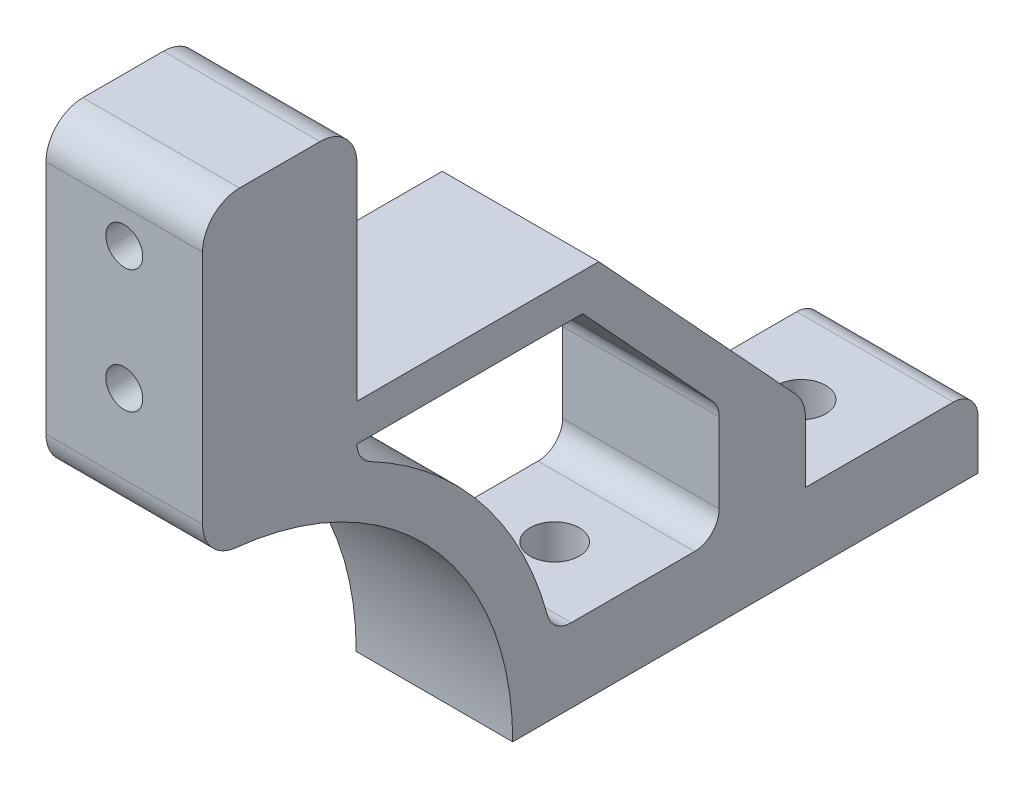
ISO-10303-21;
HEADER;
FILE_DESCRIPTION(('STEP AP214'),'2;1');
FILE_NAME('part.step','',(''),(''),'','','');
FILE_SCHEMA(('AUTOMOTIVE_DESIGN { 1 0 10303 214 1 1 1 1 }'));
ENDSEC;
DATA;
#1=APPLICATION_CONTEXT('core data for automotive mechanical design processes');
#2=APPLICATION_PROTOCOL_DEFINITION('international standard','automotive_design',2000,#1);
#3=PRODUCT_CONTEXT('',#1,'mechanical');
#4=PRODUCT('Part','Part','',(#3));
#5=PRODUCT_RELATED_PRODUCT_CATEGORY('part','',(#4));
#6=PRODUCT_DEFINITION_FORMATION('','',#4);
#7=PRODUCT_DEFINITION_CONTEXT('part definition',#1,'design');
#8=PRODUCT_DEFINITION('design','',#6,#7);
#9=PRODUCT_DEFINITION_SHAPE('','',#8);
#10=(LENGTH_UNIT() NAMED_UNIT(*) SI_UNIT(.MILLI.,.METRE.));
#11=(NAMED_UNIT(*) PLANE_ANGLE_UNIT() SI_UNIT($,.RADIAN.));
#12=(NAMED_UNIT(*) SI_UNIT($,.STERADIAN.) SOLID_ANGLE_UNIT());
#13=UNCERTAINTY_MEASURE_WITH_UNIT(LENGTH_MEASURE(1.E-05),#10,'distance_accuracy_value','');
#14=(GEOMETRIC_REPRESENTATION_CONTEXT(3) GLOBAL_UNCERTAINTY_ASSIGNED_CONTEXT((#13)) GLOBAL_UNIT_ASSIGNED_CONTEXT((#10,
#11,#12)) REPRESENTATION_CONTEXT('',''));
#15=CARTESIAN_POINT('',(0.,0.,0.));
#16=DIRECTION('',(0.,0.,1.));
#17=DIRECTION('',(1.,0.,0.));
#18=AXIS2_PLACEMENT_3D('',#15,#16,#17);
#19=CARTESIAN_POINT('',(12.7,8.92166748068362,-46.9999999999973));
#20=DIRECTION('',(-1.,0.,0.));
#21=DIRECTION('',(0.,0.,1.));
#22=AXIS2_PLACEMENT_3D('',#19,#20,#21);
#23=PLANE('',#22);
#24=DIRECTION('',(0.,0.,1.));
#25=VECTOR('',#24,1.);
#26=CARTESIAN_POINT('',(12.7,28.2515815883742,-13.6143991895037));
#27=LINE('',#26,#25);
#28=CARTESIAN_POINT('',(12.7,28.2515815883742,-33.2348630597838));
#29=VERTEX_POINT('',#28);
#30=CARTESIAN_POINT('',(12.7,28.2515815883742,-13.6143991895037));
#31=VERTEX_POINT('',#30);
#32=EDGE_CURVE('E308',#29,#31,#27,.T.);
#33=ORIENTED_EDGE('',*,*,#32,.T.);
#34=DIRECTION('',(0.,1.,0.));
#35=VECTOR('',#34,1.);
#36=CARTESIAN_POINT('',(12.7,39.9642299118946,-13.6143991895038));
#37=LINE('',#36,#35);
#38=CARTESIAN_POINT('',(12.7,45.0000000000114,-13.6143991895038));
#39=VERTEX_POINT('',#38);
#40=EDGE_CURVE('E312',#31,#39,#37,.T.);
#41=ORIENTED_EDGE('',*,*,#40,.T.);
#42=CARTESIAN_POINT('',(12.7,45.0000000000114,-10.6143991895038));
#43=DIRECTION('',(1.,0.,0.));
#44=DIRECTION('',(0.,0.,-1.));
#45=AXIS2_PLACEMENT_3D('',#42,#43,#44);
#46=CIRCLE('',#45,3.);
#47=CARTESIAN_POINT('',(12.7,48.0000000000114,-10.6143991895037));
#48=VERTEX_POINT('',#47);
#49=EDGE_CURVE('E316',#39,#48,#46,.T.);
#50=ORIENTED_EDGE('',*,*,#49,.T.);
#51=DIRECTION('',(0.,0.,1.));
#52=VECTOR('',#51,1.);
#53=CARTESIAN_POINT('',(12.7,48.0000000000114,-4.0846846062337));
#54=LINE('',#53,#52);
#55=CARTESIAN_POINT('',(12.7,48.0000000000114,-4.0846846062337));
#56=VERTEX_POINT('',#55);
#57=EDGE_CURVE('E319',#48,#56,#54,.T.);
#58=ORIENTED_EDGE('',*,*,#57,.T.);
#59=CARTESIAN_POINT('',(12.7,45.0000000000114,-4.08468460623368));
#60=DIRECTION('',(1.,0.,0.));
#61=DIRECTION('',(0.,0.,1.));
#62=AXIS2_PLACEMENT_3D('',#59,#60,#61);
#63=CIRCLE('',#62,3.);
#64=CARTESIAN_POINT('',(12.7,45.0000000000114,-1.08468460623368));
#65=VERTEX_POINT('',#64);
#66=EDGE_CURVE('E322',#56,#65,#63,.T.);
#67=ORIENTED_EDGE('',*,*,#66,.T.);
#68=DIRECTION('',(0.,-1.,0.));
#69=VECTOR('',#68,1.);
#70=CARTESIAN_POINT('',(12.7,25.8574133060414,-1.08468460623368));
#71=LINE('',#70,#69);
#72=CARTESIAN_POINT('',(12.7,25.8574133060414,-1.08468460623368));
#73=VERTEX_POINT('',#72);
#74=EDGE_CURVE('E325',#65,#73,#71,.T.);
#75=ORIENTED_EDGE('',*,*,#74,.T.);
#76=CARTESIAN_POINT('',(12.7,25.8574133060414,-4.08468460623368));
#77=DIRECTION('',(1.,0.,0.));
#78=DIRECTION('',(0.,0.,1.));
#79=AXIS2_PLACEMENT_3D('',#76,#77,#78);
#80=CIRCLE('',#79,3.);
#81=CARTESIAN_POINT('',(12.7,22.8727826576573,-3.78140273614149));
#82=VERTEX_POINT('',#81);
#83=EDGE_CURVE('E328',#73,#82,#80,.T.);
#84=ORIENTED_EDGE('',*,*,#83,.T.);
#85=CARTESIAN_POINT('',(12.7,-1.99913941220975,-1.25405381870654));
#86=DIRECTION('',(-1.,0.,0.));
#87=DIRECTION('',(0.,0.,1.));
#88=AXIS2_PLACEMENT_3D('',#85,#86,#87);
#89=CIRCLE('',#88,25.);
#90=CARTESIAN_POINT('',(12.7,-1.99913941220964,-26.2540538187065));
#91=VERTEX_POINT('',#90);
#92=EDGE_CURVE('E331',#82,#91,#89,.T.);
#93=ORIENTED_EDGE('',*,*,#92,.T.);
#94=DIRECTION('',(0.,0.,-1.));
#95=VECTOR('',#94,1.);
#96=CARTESIAN_POINT('',(12.7,-1.99913941220964,-26.2540538187065));
#97=LINE('',#96,#95);
#98=CARTESIAN_POINT('',(12.7,-1.99913941220963,-63.9999999999972));
#99=VERTEX_POINT('',#98);
#100=EDGE_CURVE('E334',#91,#99,#97,.T.);
#101=ORIENTED_EDGE('',*,*,#100,.T.);
#102=DIRECTION('',(0.,1.,0.));
#103=VECTOR('',#102,1.);
#104=CARTESIAN_POINT('',(12.7,2.00086058779035,-63.9999999999973));
#105=LINE('',#104,#103);
#106=CARTESIAN_POINT('',(12.7,2.00086058779035,-63.9999999999973));
#107=VERTEX_POINT('',#106);
#108=EDGE_CURVE('E337',#99,#107,#105,.T.);
#109=ORIENTED_EDGE('',*,*,#108,.T.);
#110=CARTESIAN_POINT('',(12.7,2.00086058779037,-61.9999999999973));
#111=DIRECTION('',(1.,0.,0.));
#112=DIRECTION('',(0.,0.,1.));
#113=AXIS2_PLACEMENT_3D('',#110,#111,#112);
#114=CIRCLE('',#113,2.);
#115=CARTESIAN_POINT('',(12.7,4.00086058779037,-61.9999999999972));
#116=VERTEX_POINT('',#115);
#117=EDGE_CURVE('E340',#107,#116,#114,.T.);
#118=ORIENTED_EDGE('',*,*,#117,.T.);
#119=DIRECTION('',(0.,0.,1.));
#120=VECTOR('',#119,1.);
#121=CARTESIAN_POINT('',(12.7,4.00086058779036,-49.9999999999973));
#122=LINE('',#121,#120);
#123=CARTESIAN_POINT('',(12.7,4.00086058779036,-49.9999999999973));
#124=VERTEX_POINT('',#123);
#125=EDGE_CURVE('E343',#116,#124,#122,.T.);
#126=ORIENTED_EDGE('',*,*,#125,.T.);
#127=DIRECTION('',(0.,1.,0.));
#128=VECTOR('',#127,1.);
#129=CARTESIAN_POINT('',(12.7,4.00086058779036,-49.9999999999973));
#130=LINE('',#129,#128);
#131=CARTESIAN_POINT('',(12.7,8.92166748068362,-49.9999999999973));
#132=VERTEX_POINT('',#131);
#133=EDGE_CURVE('E346',#124,#132,#130,.T.);
#134=ORIENTED_EDGE('',*,*,#133,.T.);
#135=CARTESIAN_POINT('',(12.7,8.92166748068362,-46.9999999999973));
#136=DIRECTION('',(1.,0.,0.));
#137=DIRECTION('',(0.,0.,1.));
#138=AXIS2_PLACEMENT_3D('',#135,#136,#137);
#139=CIRCLE('',#138,3.);
#140=CARTESIAN_POINT('',(12.7,10.9568424444333,-49.2041013740104));
#141=VERTEX_POINT('',#140);
#142=EDGE_CURVE('E349',#132,#141,#139,.T.);
#143=ORIENTED_EDGE('',*,*,#142,.T.);
#144=DIRECTION('',(0.,0.734700458004376,0.67839165458322));
#145=VECTOR('',#144,1.);
#146=CARTESIAN_POINT('',(12.7,10.9568424444333,-49.2041013740104));
#147=LINE('',#146,#145);
#148=EDGE_CURVE('E352',#141,#29,#147,.T.);
#149=ORIENTED_EDGE('',*,*,#148,.T.);
#150=EDGE_LOOP('',(#33,#41,#50,#58,#67,#75,#84,#93,#101,#109,#118,#126,#134,#143,#149));
#151=FACE_BOUND('',#150,.T.);
#152=CARTESIAN_POINT('',(12.7,12.4715383137878,-40.9999999999973));
#153=DIRECTION('',(1.,0.,0.));
#154=DIRECTION('',(0.,0.,1.));
#155=AXIS2_PLACEMENT_3D('',#152,#153,#154);
#156=CIRCLE('',#155,2.);
#157=CARTESIAN_POINT('',(12.7,12.4715383137878,-42.9999999999973));
#158=VERTEX_POINT('',#157);
#159=CARTESIAN_POINT('',(12.7,13.8283216229542,-42.469400916006));
#160=VERTEX_POINT('',#159);
#161=EDGE_CURVE('E207',#158,#160,#156,.T.);
#162=ORIENTED_EDGE('',*,*,#161,.F.);
#163=DIRECTION('',(0.,1.,0.));
#164=VECTOR('',#163,1.);
#165=CARTESIAN_POINT('',(12.7,12.4715383137878,-42.9999999999973));
#166=LINE('',#165,#164);
#167=CARTESIAN_POINT('',(12.7,6.00086058779037,-42.9999999999973));
#168=VERTEX_POINT('',#167);
#169=EDGE_CURVE('E252',#168,#158,#166,.T.);
#170=ORIENTED_EDGE('',*,*,#169,.F.);
#171=CARTESIAN_POINT('',(12.7,6.00086058779037,-40.9999999999973));
#172=DIRECTION('',(1.,0.,0.));
#173=DIRECTION('',(0.,0.,1.));
#174=AXIS2_PLACEMENT_3D('',#171,#172,#173);
#175=CIRCLE('',#174,2.);
#176=CARTESIAN_POINT('',(12.7,4.00086058779036,-40.9999999999973));
#177=VERTEX_POINT('',#176);
#178=EDGE_CURVE('E249',#177,#168,#175,.T.);
#179=ORIENTED_EDGE('',*,*,#178,.F.);
#180=DIRECTION('',(0.,0.,-1.));
#181=VECTOR('',#180,1.);
#182=CARTESIAN_POINT('',(12.7,4.00086058779036,-40.9999999999973));
#183=LINE('',#182,#181);
#184=CARTESIAN_POINT('',(12.7,4.00086058779037,-30.9999999999973));
#185=VERTEX_POINT('',#184);
#186=EDGE_CURVE('E246',#185,#177,#183,.T.);
#187=ORIENTED_EDGE('',*,*,#186,.F.);
#188=CARTESIAN_POINT('',(12.7,6.00086058779036,-30.9999999999973));
#189=DIRECTION('',(1.,0.,0.));
#190=DIRECTION('',(0.,0.,1.));
#191=AXIS2_PLACEMENT_3D('',#188,#189,#190);
#192=CIRCLE('',#191,2.);
#193=CARTESIAN_POINT('',(12.7,5.4814297055303,-29.0686296164212));
#194=VERTEX_POINT('',#193);
#195=EDGE_CURVE('E243',#194,#185,#192,.T.);
#196=ORIENTED_EDGE('',*,*,#195,.F.);
#197=CARTESIAN_POINT('',(12.7,-1.99913941220975,-1.25405381870654));
#198=DIRECTION('',(-1.,0.,0.));
#199=DIRECTION('',(0.,0.,-1.));
#200=AXIS2_PLACEMENT_3D('',#197,#198,#199);
#201=CIRCLE('',#200,28.8029432720356);
#202=CARTESIAN_POINT('',(12.7,23.4822233319297,-14.6819983313147));
#203=VERTEX_POINT('',#202);
#204=EDGE_CURVE('E240',#203,#194,#201,.T.);
#205=ORIENTED_EDGE('',*,*,#204,.F.);
#206=CARTESIAN_POINT('',(12.7,25.2515815883742,-15.6143991895038));
#207=DIRECTION('',(1.,0.,0.));
#208=DIRECTION('',(0.,0.,-1.));
#209=AXIS2_PLACEMENT_3D('',#206,#207,#208);
#210=CIRCLE('',#209,2.);
#211=CARTESIAN_POINT('',(12.7,25.2515815883742,-13.6143991895038));
#212=VERTEX_POINT('',#211);
#213=EDGE_CURVE('E234',#212,#203,#210,.T.);
#214=ORIENTED_EDGE('',*,*,#213,.F.);
#215=DIRECTION('',(0.,0.,1.));
#216=VECTOR('',#215,1.);
#217=CARTESIAN_POINT('',(12.7,25.2515815883742,-13.6143991895038));
#218=LINE('',#217,#216);
#219=CARTESIAN_POINT('',(12.7,25.2515815883742,-31.9216407448406));
#220=VERTEX_POINT('',#219);
#221=EDGE_CURVE('E230',#220,#212,#218,.T.);
#222=ORIENTED_EDGE('',*,*,#221,.F.);
#223=DIRECTION('',(0.,0.734700458004377,0.67839165458322));
#224=VECTOR('',#223,1.);
#225=CARTESIAN_POINT('',(12.7,13.8283216229542,-42.469400916006));
#226=LINE('',#225,#224);
#227=EDGE_CURVE('E216',#160,#220,#226,.T.);
#228=ORIENTED_EDGE('',*,*,#227,.F.);
#229=EDGE_LOOP('',(#162,#170,#179,#187,#196,#205,#214,#222,#228));
#230=FACE_BOUND('',#229,.T.);
#231=ADVANCED_FACE('F43',(#151,#230),#23,.F.);
#232=CARTESIAN_POINT('',(0.,8.92166748068362,-46.9999999999973));
#233=DIRECTION('',(-1.,0.,0.));
#234=DIRECTION('',(0.,0.,1.));
#235=AXIS2_PLACEMENT_3D('',#232,#233,#234);
#236=PLANE('',#235);
#237=DIRECTION('',(0.,0.,1.));
#238=VECTOR('',#237,1.);
#239=CARTESIAN_POINT('',(0.,28.2515815883742,-13.6143991895037));
#240=LINE('',#239,#238);
#241=CARTESIAN_POINT('',(0.,28.2515815883742,-33.2348630597838));
#242=VERTEX_POINT('',#241);
#243=CARTESIAN_POINT('',(0.,28.2515815883742,-13.6143991895037));
#244=VERTEX_POINT('',#243);
#245=EDGE_CURVE('E225',#242,#244,#240,.T.);
#246=ORIENTED_EDGE('',*,*,#245,.F.);
#247=DIRECTION('',(0.,0.734700458004376,0.67839165458322));
#248=VECTOR('',#247,1.);
#249=CARTESIAN_POINT('',(0.,10.9568424444333,-49.2041013740104));
#250=LINE('',#249,#248);
#251=CARTESIAN_POINT('',(0.,10.9568424444333,-49.2041013740104));
#252=VERTEX_POINT('',#251);
#253=EDGE_CURVE('E313',#252,#242,#250,.T.);
#254=ORIENTED_EDGE('',*,*,#253,.F.);
#255=CARTESIAN_POINT('',(0.,8.92166748068362,-46.9999999999973));
#256=DIRECTION('',(1.,0.,0.));
#257=DIRECTION('',(0.,0.,1.));
#258=AXIS2_PLACEMENT_3D('',#255,#256,#257);
#259=CIRCLE('',#258,3.);
#260=CARTESIAN_POINT('',(0.,8.92166748068362,-49.9999999999973));
#261=VERTEX_POINT('',#260);
#262=EDGE_CURVE('E395',#261,#252,#259,.T.);
#263=ORIENTED_EDGE('',*,*,#262,.F.);
#264=DIRECTION('',(0.,1.,0.));
#265=VECTOR('',#264,1.);
#266=CARTESIAN_POINT('',(0.,4.00086058779036,-49.9999999999973));
#267=LINE('',#266,#265);
#268=CARTESIAN_POINT('',(0.,4.00086058779036,-49.9999999999973));
#269=VERTEX_POINT('',#268);
#270=EDGE_CURVE('E392',#269,#261,#267,.T.);
#271=ORIENTED_EDGE('',*,*,#270,.F.);
#272=DIRECTION('',(0.,0.,1.));
#273=VECTOR('',#272,1.);
#274=CARTESIAN_POINT('',(0.,4.00086058779036,-49.9999999999973));
#275=LINE('',#274,#273);
#276=CARTESIAN_POINT('',(0.,4.00086058779037,-61.9999999999972));
#277=VERTEX_POINT('',#276);
#278=EDGE_CURVE('E389',#277,#269,#275,.T.);
#279=ORIENTED_EDGE('',*,*,#278,.F.);
#280=CARTESIAN_POINT('',(0.,2.00086058779037,-61.9999999999973));
#281=DIRECTION('',(1.,0.,0.));
#282=DIRECTION('',(0.,0.,1.));
#283=AXIS2_PLACEMENT_3D('',#280,#281,#282);
#284=CIRCLE('',#283,2.);
#285=CARTESIAN_POINT('',(0.,2.00086058779035,-63.9999999999973));
#286=VERTEX_POINT('',#285);
#287=EDGE_CURVE('E386',#286,#277,#284,.T.);
#288=ORIENTED_EDGE('',*,*,#287,.F.);
#289=DIRECTION('',(0.,1.,0.));
#290=VECTOR('',#289,1.);
#291=CARTESIAN_POINT('',(0.,2.00086058779035,-63.9999999999973));
#292=LINE('',#291,#290);
#293=CARTESIAN_POINT('',(0.,-1.99913941220963,-63.9999999999972));
#294=VERTEX_POINT('',#293);
#295=EDGE_CURVE('E383',#294,#286,#292,.T.);
#296=ORIENTED_EDGE('',*,*,#295,.F.);
#297=DIRECTION('',(0.,0.,-1.));
#298=VECTOR('',#297,1.);
#299=CARTESIAN_POINT('',(0.,-1.99913941220964,-26.2540538187065));
#300=LINE('',#299,#298);
#301=CARTESIAN_POINT('',(0.,-1.99913941220964,-26.2540538187065));
#302=VERTEX_POINT('',#301);
#303=EDGE_CURVE('E380',#302,#294,#300,.T.);
#304=ORIENTED_EDGE('',*,*,#303,.F.);
#305=CARTESIAN_POINT('',(0.,-1.99913941220975,-1.25405381870654));
#306=DIRECTION('',(-1.,0.,0.));
#307=DIRECTION('',(0.,0.,1.));
#308=AXIS2_PLACEMENT_3D('',#305,#306,#307);
#309=CIRCLE('',#308,25.);
#310=CARTESIAN_POINT('',(0.,22.8727826576573,-3.78140273614149));
#311=VERTEX_POINT('',#310);
#312=EDGE_CURVE('E377',#311,#302,#309,.T.);
#313=ORIENTED_EDGE('',*,*,#312,.F.);
#314=CARTESIAN_POINT('',(0.,25.8574133060414,-4.08468460623368));
#315=DIRECTION('',(1.,0.,0.));
#316=DIRECTION('',(0.,0.,1.));
#317=AXIS2_PLACEMENT_3D('',#314,#315,#316);
#318=CIRCLE('',#317,3.);
#319=CARTESIAN_POINT('',(0.,25.8574133060414,-1.08468460623368));
#320=VERTEX_POINT('',#319);
#321=EDGE_CURVE('E374',#320,#311,#318,.T.);
#322=ORIENTED_EDGE('',*,*,#321,.F.);
#323=DIRECTION('',(0.,-1.,0.));
#324=VECTOR('',#323,1.);
#325=CARTESIAN_POINT('',(0.,25.8574133060414,-1.08468460623368));
#326=LINE('',#325,#324);
#327=CARTESIAN_POINT('',(0.,45.0000000000114,-1.08468460623368));
#328=VERTEX_POINT('',#327);
#329=EDGE_CURVE('E371',#328,#320,#326,.T.);
#330=ORIENTED_EDGE('',*,*,#329,.F.);
#331=CARTESIAN_POINT('',(0.,45.0000000000114,-4.08468460623368));
#332=DIRECTION('',(1.,0.,0.));
#333=DIRECTION('',(0.,0.,1.));
#334=AXIS2_PLACEMENT_3D('',#331,#332,#333);
#335=CIRCLE('',#334,3.);
#336=CARTESIAN_POINT('',(0.,48.0000000000114,-4.0846846062337));
#337=VERTEX_POINT('',#336);
#338=EDGE_CURVE('E368',#337,#328,#335,.T.);
#339=ORIENTED_EDGE('',*,*,#338,.F.);
#340=DIRECTION('',(0.,0.,1.));
#341=VECTOR('',#340,1.);
#342=CARTESIAN_POINT('',(0.,48.0000000000114,-4.0846846062337));
#343=LINE('',#342,#341);
#344=CARTESIAN_POINT('',(0.,48.0000000000114,-10.6143991895037));
#345=VERTEX_POINT('',#344);
#346=EDGE_CURVE('E365',#345,#337,#343,.T.);
#347=ORIENTED_EDGE('',*,*,#346,.F.);
#348=CARTESIAN_POINT('',(0.,45.0000000000114,-10.6143991895038));
#349=DIRECTION('',(1.,0.,0.));
#350=DIRECTION('',(0.,0.,-1.));
#351=AXIS2_PLACEMENT_3D('',#348,#349,#350);
#352=CIRCLE('',#351,3.);
#353=CARTESIAN_POINT('',(0.,45.0000000000114,-13.6143991895038));
#354=VERTEX_POINT('',#353);
#355=EDGE_CURVE('E362',#354,#345,#352,.T.);
#356=ORIENTED_EDGE('',*,*,#355,.F.);
#357=DIRECTION('',(0.,1.,0.));
#358=VECTOR('',#357,1.);
#359=CARTESIAN_POINT('',(0.,39.9642299118946,-13.6143991895038));
#360=LINE('',#359,#358);
#361=EDGE_CURVE('E359',#244,#354,#360,.T.);
#362=ORIENTED_EDGE('',*,*,#361,.F.);
#363=EDGE_LOOP('',(#246,#254,#263,#271,#279,#288,#296,#304,#313,#322,#330,#339,#347,#356,#362));
#364=FACE_BOUND('',#363,.T.);
#365=DIRECTION('',(0.,1.,0.));
#366=VECTOR('',#365,1.);
#367=CARTESIAN_POINT('',(0.,12.4715383137878,-42.9999999999973));
#368=LINE('',#367,#366);
#369=CARTESIAN_POINT('',(0.,6.00086058779037,-42.9999999999973));
#370=VERTEX_POINT('',#369);
#371=CARTESIAN_POINT('',(0.,12.4715383137878,-42.9999999999973));
#372=VERTEX_POINT('',#371);
#373=EDGE_CURVE('E217',#370,#372,#368,.T.);
#374=ORIENTED_EDGE('',*,*,#373,.T.);
#375=CARTESIAN_POINT('',(0.,12.4715383137878,-40.9999999999973));
#376=DIRECTION('',(1.,0.,0.));
#377=DIRECTION('',(0.,0.,1.));
#378=AXIS2_PLACEMENT_3D('',#375,#376,#377);
#379=CIRCLE('',#378,2.);
#380=CARTESIAN_POINT('',(0.,13.8283216229542,-42.469400916006));
#381=VERTEX_POINT('',#380);
#382=EDGE_CURVE('E69',#372,#381,#379,.T.);
#383=ORIENTED_EDGE('',*,*,#382,.T.);
#384=DIRECTION('',(0.,0.734700458004377,0.67839165458322));
#385=VECTOR('',#384,1.);
#386=CARTESIAN_POINT('',(0.,13.8283216229542,-42.469400916006));
#387=LINE('',#386,#385);
#388=CARTESIAN_POINT('',(0.,25.2515815883742,-31.9216407448406));
#389=VERTEX_POINT('',#388);
#390=EDGE_CURVE('E223',#381,#389,#387,.T.);
#391=ORIENTED_EDGE('',*,*,#390,.T.);
#392=DIRECTION('',(0.,0.,1.));
#393=VECTOR('',#392,1.);
#394=CARTESIAN_POINT('',(0.,25.2515815883742,-13.6143991895038));
#395=LINE('',#394,#393);
#396=CARTESIAN_POINT('',(0.,25.2515815883742,-13.6143991895038));
#397=VERTEX_POINT('',#396);
#398=EDGE_CURVE('E260',#389,#397,#395,.T.);
#399=ORIENTED_EDGE('',*,*,#398,.T.);
#400=CARTESIAN_POINT('',(0.,25.2515815883742,-15.6143991895038));
#401=DIRECTION('',(1.,0.,0.));
#402=DIRECTION('',(0.,0.,-1.));
#403=AXIS2_PLACEMENT_3D('',#400,#401,#402);
#404=CIRCLE('',#403,2.);
#405=CARTESIAN_POINT('',(0.,23.4822233319297,-14.6819983313147));
#406=VERTEX_POINT('',#405);
#407=EDGE_CURVE('E264',#397,#406,#404,.T.);
#408=ORIENTED_EDGE('',*,*,#407,.T.);
#409=CARTESIAN_POINT('',(0.,-1.99913941220975,-1.25405381870654));
#410=DIRECTION('',(-1.,0.,0.));
#411=DIRECTION('',(0.,0.,-1.));
#412=AXIS2_PLACEMENT_3D('',#409,#410,#411);
#413=CIRCLE('',#412,28.8029432720356);
#414=CARTESIAN_POINT('',(0.,5.4814297055303,-29.0686296164212));
#415=VERTEX_POINT('',#414);
#416=EDGE_CURVE('E268',#406,#415,#413,.T.);
#417=ORIENTED_EDGE('',*,*,#416,.T.);
#418=CARTESIAN_POINT('',(0.,6.00086058779036,-30.9999999999973));
#419=DIRECTION('',(1.,0.,0.));
#420=DIRECTION('',(0.,0.,1.));
#421=AXIS2_PLACEMENT_3D('',#418,#419,#420);
#422=CIRCLE('',#421,2.);
#423=CARTESIAN_POINT('',(0.,4.00086058779037,-30.9999999999973));
#424=VERTEX_POINT('',#423);
#425=EDGE_CURVE('E272',#415,#424,#422,.T.);
#426=ORIENTED_EDGE('',*,*,#425,.T.);
#427=DIRECTION('',(0.,0.,-1.));
#428=VECTOR('',#427,1.);
#429=CARTESIAN_POINT('',(0.,4.00086058779036,-40.9999999999973));
#430=LINE('',#429,#428);
#431=CARTESIAN_POINT('',(0.,4.00086058779036,-40.9999999999973));
#432=VERTEX_POINT('',#431);
#433=EDGE_CURVE('E276',#424,#432,#430,.T.);
#434=ORIENTED_EDGE('',*,*,#433,.T.);
#435=CARTESIAN_POINT('',(0.,6.00086058779037,-40.9999999999973));
#436=DIRECTION('',(1.,0.,0.));
#437=DIRECTION('',(0.,0.,1.));
#438=AXIS2_PLACEMENT_3D('',#435,#436,#437);
#439=CIRCLE('',#438,2.);
#440=EDGE_CURVE('E280',#432,#370,#439,.T.);
#441=ORIENTED_EDGE('',*,*,#440,.T.);
#442=EDGE_LOOP('',(#374,#383,#391,#399,#408,#417,#426,#434,#441));
#443=FACE_BOUND('',#442,.T.);
#444=ADVANCED_FACE('F506',(#364,#443),#236,.T.);
#445=CARTESIAN_POINT('',(12.7,28.2515815883742,-13.6143991895037));
#446=DIRECTION('',(0.,-1.,0.));
#447=DIRECTION('',(0.,0.,-1.));
#448=AXIS2_PLACEMENT_3D('',#445,#446,#447);
#449=PLANE('',#448);
#450=ORIENTED_EDGE('',*,*,#245,.T.);
#451=DIRECTION('',(-1.,0.,0.));
#452=VECTOR('',#451,1.);
#453=CARTESIAN_POINT('',(12.7,28.2515815883742,-13.6143991895037));
#454=LINE('',#453,#452);
#455=EDGE_CURVE('E11',#31,#244,#454,.T.);
#456=ORIENTED_EDGE('',*,*,#455,.F.);
#457=ORIENTED_EDGE('',*,*,#32,.F.);
#458=DIRECTION('',(-1.,0.,0.));
#459=VECTOR('',#458,1.);
#460=CARTESIAN_POINT('',(12.7,28.2515815883742,-33.2348630597838));
#461=LINE('',#460,#459);
#462=EDGE_CURVE('E355',#29,#242,#461,.T.);
#463=ORIENTED_EDGE('',*,*,#462,.T.);
#464=EDGE_LOOP('',(#450,#456,#457,#463));
#465=FACE_BOUND('',#464,.T.);
#466=ADVANCED_FACE('F45',(#465),#449,.F.);
#467=CARTESIAN_POINT('',(12.7,39.9642299118946,-13.6143991895038));
#468=DIRECTION('',(0.,0.,1.));
#469=DIRECTION('',(1.,0.,0.));
#470=AXIS2_PLACEMENT_3D('',#467,#468,#469);
#471=PLANE('',#470);
#472=CARTESIAN_POINT('',(6.35,32.2515815883742,-13.6143991895037));
#473=DIRECTION('',(0.,0.,-1.));
#474=DIRECTION('',(0.,1.,0.));
#475=AXIS2_PLACEMENT_3D('',#472,#473,#474);
#476=CIRCLE('',#475,1.5);
#477=CARTESIAN_POINT('',(6.35,33.7515815883742,-13.6143991895037));
#478=VERTEX_POINT('',#477);
#479=EDGE_CURVE('E456',#478,#478,#476,.T.);
#480=ORIENTED_EDGE('',*,*,#479,.F.);
#481=EDGE_LOOP('',(#480));
#482=FACE_BOUND('',#481,.T.);
#483=CARTESIAN_POINT('',(6.35,42.2515815883742,-13.6143991895037));
#484=DIRECTION('',(0.,0.,-1.));
#485=DIRECTION('',(0.,1.,0.));
#486=AXIS2_PLACEMENT_3D('',#483,#484,#485);
#487=CIRCLE('',#486,1.5);
#488=CARTESIAN_POINT('',(6.35,43.7515815883742,-13.6143991895037));
#489=VERTEX_POINT('',#488);
#490=EDGE_CURVE('E464',#489,#489,#487,.T.);
#491=ORIENTED_EDGE('',*,*,#490,.F.);
#492=EDGE_LOOP('',(#491));
#493=FACE_BOUND('',#492,.T.);
#494=ORIENTED_EDGE('',*,*,#361,.T.);
#495=DIRECTION('',(-1.,0.,0.));
#496=VECTOR('',#495,1.);
#497=CARTESIAN_POINT('',(12.7,45.0000000000114,-13.6143991895038));
#498=LINE('',#497,#496);
#499=EDGE_CURVE('E53',#39,#354,#498,.T.);
#500=ORIENTED_EDGE('',*,*,#499,.F.);
#501=ORIENTED_EDGE('',*,*,#40,.F.);
#502=ORIENTED_EDGE('',*,*,#455,.T.);
#503=EDGE_LOOP('',(#494,#500,#501,#502));
#504=FACE_BOUND('',#503,.T.);
#505=ADVANCED_FACE('F565',(#482,#493,#504),#471,.F.);
#506=CARTESIAN_POINT('',(12.7,45.0000000000114,-10.6143991895038));
#507=DIRECTION('',(-1.,0.,0.));
#508=DIRECTION('',(0.,0.,1.));
#509=AXIS2_PLACEMENT_3D('',#506,#507,#508);
#510=CYLINDRICAL_SURFACE('',#509,3.);
#511=ORIENTED_EDGE('',*,*,#355,.T.);
#512=DIRECTION('',(-1.,0.,0.));
#513=VECTOR('',#512,1.);
#514=CARTESIAN_POINT('',(12.7,48.0000000000114,-10.6143991895037));
#515=LINE('',#514,#513);
#516=EDGE_CURVE('E447',#48,#345,#515,.T.);
#517=ORIENTED_EDGE('',*,*,#516,.F.);
#518=ORIENTED_EDGE('',*,*,#49,.F.);
#519=ORIENTED_EDGE('',*,*,#499,.T.);
#520=EDGE_LOOP('',(#511,#517,#518,#519));
#521=FACE_BOUND('',#520,.T.);
#522=ADVANCED_FACE('F562',(#521),#510,.T.);
#523=CARTESIAN_POINT('',(12.7,48.0000000000114,-4.0846846062337));
#524=DIRECTION('',(0.,-1.,0.));
#525=DIRECTION('',(0.,0.,-1.));
#526=AXIS2_PLACEMENT_3D('',#523,#524,#525);
#527=PLANE('',#526);
#528=ORIENTED_EDGE('',*,*,#346,.T.);
#529=DIRECTION('',(-1.,0.,0.));
#530=VECTOR('',#529,1.);
#531=CARTESIAN_POINT('',(12.7,48.0000000000114,-4.0846846062337));
#532=LINE('',#531,#530);
#533=EDGE_CURVE('E443',#56,#337,#532,.T.);
#534=ORIENTED_EDGE('',*,*,#533,.F.);
#535=ORIENTED_EDGE('',*,*,#57,.F.);
#536=ORIENTED_EDGE('',*,*,#516,.T.);
#537=EDGE_LOOP('',(#528,#534,#535,#536));
#538=FACE_BOUND('',#537,.T.);
#539=ADVANCED_FACE('F558',(#538),#527,.F.);
#540=CARTESIAN_POINT('',(12.7,45.0000000000114,-4.08468460623368));
#541=DIRECTION('',(-1.,0.,0.));
#542=DIRECTION('',(0.,0.,1.));
#543=AXIS2_PLACEMENT_3D('',#540,#541,#542);
#544=CYLINDRICAL_SURFACE('',#543,3.);
#545=ORIENTED_EDGE('',*,*,#338,.T.);
#546=DIRECTION('',(-1.,0.,0.));
#547=VECTOR('',#546,1.);
#548=CARTESIAN_POINT('',(12.7,45.0000000000114,-1.08468460623368));
#549=LINE('',#548,#547);
#550=EDGE_CURVE('E439',#65,#328,#549,.T.);
#551=ORIENTED_EDGE('',*,*,#550,.F.);
#552=ORIENTED_EDGE('',*,*,#66,.F.);
#553=ORIENTED_EDGE('',*,*,#533,.T.);
#554=EDGE_LOOP('',(#545,#551,#552,#553));
#555=FACE_BOUND('',#554,.T.);
#556=ADVANCED_FACE('F554',(#555),#544,.T.);
#557=CARTESIAN_POINT('',(12.7,25.8574133060414,-1.08468460623368));
#558=DIRECTION('',(0.,0.,-1.));
#559=DIRECTION('',(-1.,0.,0.));
#560=AXIS2_PLACEMENT_3D('',#557,#558,#559);
#561=PLANE('',#560);
#562=CARTESIAN_POINT('',(6.35,32.2515815883742,-1.08468460623368));
#563=DIRECTION('',(0.,0.,-1.));
#564=DIRECTION('',(-1.,0.,0.));
#565=AXIS2_PLACEMENT_3D('',#562,#563,#564);
#566=CIRCLE('',#565,1.5);
#567=CARTESIAN_POINT('',(4.85,32.2515815883742,-1.08468460623368));
#568=VERTEX_POINT('',#567);
#569=EDGE_CURVE('E47',#568,#568,#566,.T.);
#570=ORIENTED_EDGE('',*,*,#569,.T.);
#571=EDGE_LOOP('',(#570));
#572=FACE_BOUND('',#571,.T.);
#573=CARTESIAN_POINT('',(6.35,42.2515815883742,-1.08468460623368));
#574=DIRECTION('',(0.,0.,-1.));
#575=DIRECTION('',(-1.,0.,0.));
#576=AXIS2_PLACEMENT_3D('',#573,#574,#575);
#577=CIRCLE('',#576,1.5);
#578=CARTESIAN_POINT('',(4.85,42.2515815883742,-1.08468460623368));
#579=VERTEX_POINT('',#578);
#580=EDGE_CURVE('E453',#579,#579,#577,.T.);
#581=ORIENTED_EDGE('',*,*,#580,.T.);
#582=EDGE_LOOP('',(#581));
#583=FACE_BOUND('',#582,.T.);
#584=ORIENTED_EDGE('',*,*,#329,.T.);
#585=DIRECTION('',(-1.,0.,0.));
#586=VECTOR('',#585,1.);
#587=CARTESIAN_POINT('',(12.7,25.8574133060414,-1.08468460623368));
#588=LINE('',#587,#586);
#589=EDGE_CURVE('E435',#73,#320,#588,.T.);
#590=ORIENTED_EDGE('',*,*,#589,.F.);
#591=ORIENTED_EDGE('',*,*,#74,.F.);
#592=ORIENTED_EDGE('',*,*,#550,.T.);
#593=EDGE_LOOP('',(#584,#590,#591,#592));
#594=FACE_BOUND('',#593,.T.);
#595=ADVANCED_FACE('F550',(#572,#583,#594),#561,.F.);
#596=CARTESIAN_POINT('',(12.7,25.8574133060414,-4.08468460623368));
#597=DIRECTION('',(-1.,0.,0.));
#598=DIRECTION('',(0.,0.,1.));
#599=AXIS2_PLACEMENT_3D('',#596,#597,#598);
#600=CYLINDRICAL_SURFACE('',#599,3.);
#601=ORIENTED_EDGE('',*,*,#321,.T.);
#602=DIRECTION('',(-1.,0.,0.));
#603=VECTOR('',#602,1.);
#604=CARTESIAN_POINT('',(12.7,22.8727826576573,-3.78140273614149));
#605=LINE('',#604,#603);
#606=EDGE_CURVE('E431',#82,#311,#605,.T.);
#607=ORIENTED_EDGE('',*,*,#606,.F.);
#608=ORIENTED_EDGE('',*,*,#83,.F.);
#609=ORIENTED_EDGE('',*,*,#589,.T.);
#610=EDGE_LOOP('',(#601,#607,#608,#609));
#611=FACE_BOUND('',#610,.T.);
#612=ADVANCED_FACE('F546',(#611),#600,.T.);
#613=CARTESIAN_POINT('',(12.7,-1.99913941220975,-1.25405381870654));
#614=DIRECTION('',(-1.,0.,0.));
#615=DIRECTION('',(0.,0.,1.));
#616=AXIS2_PLACEMENT_3D('',#613,#614,#615);
#617=CYLINDRICAL_SURFACE('',#616,25.);
#618=ORIENTED_EDGE('',*,*,#312,.T.);
#619=DIRECTION('',(-1.,0.,0.));
#620=VECTOR('',#619,1.);
#621=CARTESIAN_POINT('',(12.7,-1.99913941220964,-26.2540538187065));
#622=LINE('',#621,#620);
#623=EDGE_CURVE('E427',#91,#302,#622,.T.);
#624=ORIENTED_EDGE('',*,*,#623,.F.);
#625=ORIENTED_EDGE('',*,*,#92,.F.);
#626=ORIENTED_EDGE('',*,*,#606,.T.);
#627=EDGE_LOOP('',(#618,#624,#625,#626));
#628=FACE_BOUND('',#627,.T.);
#629=ADVANCED_FACE('F543',(#628),#617,.F.);
#630=CARTESIAN_POINT('',(12.7,-1.99913941220964,-26.2540538187065));
#631=DIRECTION('',(0.,1.,0.));
#632=DIRECTION('',(0.,0.,1.));
#633=AXIS2_PLACEMENT_3D('',#630,#631,#632);
#634=PLANE('',#633);
#635=CARTESIAN_POINT('',(6.35,-1.99913941220963,-55.9999999999972));
#636=DIRECTION('',(0.,1.,0.));
#637=DIRECTION('',(0.,0.,1.));
#638=AXIS2_PLACEMENT_3D('',#635,#636,#637);
#639=CIRCLE('',#638,2.);
#640=CARTESIAN_POINT('',(6.35,-1.99913941220963,-53.9999999999972));
#641=VERTEX_POINT('',#640);
#642=EDGE_CURVE('E257',#641,#641,#639,.T.);
#643=ORIENTED_EDGE('',*,*,#642,.T.);
#644=EDGE_LOOP('',(#643));
#645=FACE_BOUND('',#644,.T.);
#646=CARTESIAN_POINT('',(6.35,-1.99913941220963,-35.9999999999973));
#647=DIRECTION('',(0.,1.,0.));
#648=DIRECTION('',(0.,0.,1.));
#649=AXIS2_PLACEMENT_3D('',#646,#647,#648);
#650=CIRCLE('',#649,2.);
#651=CARTESIAN_POINT('',(6.35,-1.99913941220963,-33.9999999999973));
#652=VERTEX_POINT('',#651);
#653=EDGE_CURVE('E476',#652,#652,#650,.T.);
#654=ORIENTED_EDGE('',*,*,#653,.T.);
#655=EDGE_LOOP('',(#654));
#656=FACE_BOUND('',#655,.T.);
#657=ORIENTED_EDGE('',*,*,#303,.T.);
#658=DIRECTION('',(-1.,0.,0.));
#659=VECTOR('',#658,1.);
#660=CARTESIAN_POINT('',(12.7,-1.99913941220963,-63.9999999999972));
#661=LINE('',#660,#659);
#662=EDGE_CURVE('E423',#99,#294,#661,.T.);
#663=ORIENTED_EDGE('',*,*,#662,.F.);
#664=ORIENTED_EDGE('',*,*,#100,.F.);
#665=ORIENTED_EDGE('',*,*,#623,.T.);
#666=EDGE_LOOP('',(#657,#663,#664,#665));
#667=FACE_BOUND('',#666,.T.);
#668=ADVANCED_FACE('F486',(#645,#656,#667),#634,.F.);
#669=CARTESIAN_POINT('',(12.7,2.00086058779035,-63.9999999999973));
#670=DIRECTION('',(0.,0.,1.));
#671=DIRECTION('',(0.,-1.,0.));
#672=AXIS2_PLACEMENT_3D('',#669,#670,#671);
#673=PLANE('',#672);
#674=ORIENTED_EDGE('',*,*,#295,.T.);
#675=DIRECTION('',(-1.,0.,0.));
#676=VECTOR('',#675,1.);
#677=CARTESIAN_POINT('',(12.7,2.00086058779035,-63.9999999999973));
#678=LINE('',#677,#676);
#679=EDGE_CURVE('E419',#107,#286,#678,.T.);
#680=ORIENTED_EDGE('',*,*,#679,.F.);
#681=ORIENTED_EDGE('',*,*,#108,.F.);
#682=ORIENTED_EDGE('',*,*,#662,.T.);
#683=EDGE_LOOP('',(#674,#680,#681,#682));
#684=FACE_BOUND('',#683,.T.);
#685=ADVANCED_FACE('F536',(#684),#673,.F.);
#686=CARTESIAN_POINT('',(12.7,2.00086058779037,-61.9999999999973));
#687=DIRECTION('',(-1.,0.,0.));
#688=DIRECTION('',(0.,0.,1.));
#689=AXIS2_PLACEMENT_3D('',#686,#687,#688);
#690=CYLINDRICAL_SURFACE('',#689,2.);
#691=ORIENTED_EDGE('',*,*,#287,.T.);
#692=DIRECTION('',(-1.,0.,0.));
#693=VECTOR('',#692,1.);
#694=CARTESIAN_POINT('',(12.7,4.00086058779037,-61.9999999999972));
#695=LINE('',#694,#693);
#696=EDGE_CURVE('E415',#116,#277,#695,.T.);
#697=ORIENTED_EDGE('',*,*,#696,.F.);
#698=ORIENTED_EDGE('',*,*,#117,.F.);
#699=ORIENTED_EDGE('',*,*,#679,.T.);
#700=EDGE_LOOP('',(#691,#697,#698,#699));
#701=FACE_BOUND('',#700,.T.);
#702=ADVANCED_FACE('F532',(#701),#690,.T.);
#703=CARTESIAN_POINT('',(12.7,4.00086058779036,-49.9999999999973));
#704=DIRECTION('',(0.,-1.,0.));
#705=DIRECTION('',(0.,0.,-1.));
#706=AXIS2_PLACEMENT_3D('',#703,#704,#705);
#707=PLANE('',#706);
#708=CARTESIAN_POINT('',(6.35,4.00086058779037,-55.9999999999972));
#709=DIRECTION('',(0.,1.,0.));
#710=DIRECTION('',(0.,0.,1.));
#711=AXIS2_PLACEMENT_3D('',#708,#709,#710);
#712=CIRCLE('',#711,2.);
#713=CARTESIAN_POINT('',(6.35,4.00086058779037,-53.9999999999972));
#714=VERTEX_POINT('',#713);
#715=EDGE_CURVE('E472',#714,#714,#712,.T.);
#716=ORIENTED_EDGE('',*,*,#715,.F.);
#717=EDGE_LOOP('',(#716));
#718=FACE_BOUND('',#717,.T.);
#719=ORIENTED_EDGE('',*,*,#278,.T.);
#720=DIRECTION('',(-1.,0.,0.));
#721=VECTOR('',#720,1.);
#722=CARTESIAN_POINT('',(12.7,4.00086058779036,-49.9999999999973));
#723=LINE('',#722,#721);
#724=EDGE_CURVE('E411',#124,#269,#723,.T.);
#725=ORIENTED_EDGE('',*,*,#724,.F.);
#726=ORIENTED_EDGE('',*,*,#125,.F.);
#727=ORIENTED_EDGE('',*,*,#696,.T.);
#728=EDGE_LOOP('',(#719,#725,#726,#727));
#729=FACE_BOUND('',#728,.T.);
#730=ADVANCED_FACE('F528',(#718,#729),#707,.F.);
#731=CARTESIAN_POINT('',(12.7,4.00086058779036,-49.9999999999973));
#732=DIRECTION('',(0.,0.,1.));
#733=DIRECTION('',(0.,-1.,0.));
#734=AXIS2_PLACEMENT_3D('',#731,#732,#733);
#735=PLANE('',#734);
#736=ORIENTED_EDGE('',*,*,#270,.T.);
#737=DIRECTION('',(-1.,0.,0.));
#738=VECTOR('',#737,1.);
#739=CARTESIAN_POINT('',(12.7,8.92166748068362,-49.9999999999973));
#740=LINE('',#739,#738);
#741=EDGE_CURVE('E407',#132,#261,#740,.T.);
#742=ORIENTED_EDGE('',*,*,#741,.F.);
#743=ORIENTED_EDGE('',*,*,#133,.F.);
#744=ORIENTED_EDGE('',*,*,#724,.T.);
#745=EDGE_LOOP('',(#736,#742,#743,#744));
#746=FACE_BOUND('',#745,.T.);
#747=ADVANCED_FACE('F524',(#746),#735,.F.);
#748=CARTESIAN_POINT('',(12.7,8.92166748068362,-46.9999999999973));
#749=DIRECTION('',(-1.,0.,0.));
#750=DIRECTION('',(0.,0.,1.));
#751=AXIS2_PLACEMENT_3D('',#748,#749,#750);
#752=CYLINDRICAL_SURFACE('',#751,3.);
#753=ORIENTED_EDGE('',*,*,#262,.T.);
#754=DIRECTION('',(-1.,0.,0.));
#755=VECTOR('',#754,1.);
#756=CARTESIAN_POINT('',(12.7,10.9568424444333,-49.2041013740104));
#757=LINE('',#756,#755);
#758=EDGE_CURVE('E403',#141,#252,#757,.T.);
#759=ORIENTED_EDGE('',*,*,#758,.F.);
#760=ORIENTED_EDGE('',*,*,#142,.F.);
#761=ORIENTED_EDGE('',*,*,#741,.T.);
#762=EDGE_LOOP('',(#753,#759,#760,#761));
#763=FACE_BOUND('',#762,.T.);
#764=ADVANCED_FACE('F520',(#763),#752,.T.);
#765=CARTESIAN_POINT('',(12.7,10.9568424444333,-49.2041013740104));
#766=DIRECTION('',(0.,-0.67839165458322,0.734700458004377));
#767=DIRECTION('',(0.,-0.734700458004377,-0.67839165458322));
#768=AXIS2_PLACEMENT_3D('',#765,#766,#767);
#769=PLANE('',#768);
#770=ORIENTED_EDGE('',*,*,#253,.T.);
#771=ORIENTED_EDGE('',*,*,#462,.F.);
#772=ORIENTED_EDGE('',*,*,#148,.F.);
#773=ORIENTED_EDGE('',*,*,#758,.T.);
#774=EDGE_LOOP('',(#770,#771,#772,#773));
#775=FACE_BOUND('',#774,.T.);
#776=ADVANCED_FACE('F517',(#775),#769,.F.);
#777=CARTESIAN_POINT('',(12.7,12.4715383137878,-40.9999999999973));
#778=DIRECTION('',(-1.,0.,0.));
#779=DIRECTION('',(0.,0.,1.));
#780=AXIS2_PLACEMENT_3D('',#777,#778,#779);
#781=CYLINDRICAL_SURFACE('',#780,2.);
#782=ORIENTED_EDGE('',*,*,#382,.F.);
#783=DIRECTION('',(-1.,0.,0.));
#784=VECTOR('',#783,1.);
#785=CARTESIAN_POINT('',(12.7,12.4715383137878,-42.9999999999973));
#786=LINE('',#785,#784);
#787=EDGE_CURVE('E211',#158,#372,#786,.T.);
#788=ORIENTED_EDGE('',*,*,#787,.F.);
#789=ORIENTED_EDGE('',*,*,#161,.T.);
#790=DIRECTION('',(-1.,0.,0.));
#791=VECTOR('',#790,1.);
#792=CARTESIAN_POINT('',(12.7,13.8283216229542,-42.469400916006));
#793=LINE('',#792,#791);
#794=EDGE_CURVE('E210',#160,#381,#793,.T.);
#795=ORIENTED_EDGE('',*,*,#794,.T.);
#796=EDGE_LOOP('',(#782,#788,#789,#795));
#797=FACE_BOUND('',#796,.T.);
#798=ADVANCED_FACE('F209',(#797),#781,.F.);
#799=CARTESIAN_POINT('',(12.7,13.8283216229542,-42.469400916006));
#800=DIRECTION('',(0.,-0.67839165458322,0.734700458004377));
#801=DIRECTION('',(0.,-0.734700458004377,-0.67839165458322));
#802=AXIS2_PLACEMENT_3D('',#799,#800,#801);
#803=PLANE('',#802);
#804=ORIENTED_EDGE('',*,*,#390,.F.);
#805=ORIENTED_EDGE('',*,*,#794,.F.);
#806=ORIENTED_EDGE('',*,*,#227,.T.);
#807=DIRECTION('',(-1.,0.,0.));
#808=VECTOR('',#807,1.);
#809=CARTESIAN_POINT('',(12.7,25.2515815883742,-31.9216407448406));
#810=LINE('',#809,#808);
#811=EDGE_CURVE('E226',#220,#389,#810,.T.);
#812=ORIENTED_EDGE('',*,*,#811,.T.);
#813=EDGE_LOOP('',(#804,#805,#806,#812));
#814=FACE_BOUND('',#813,.T.);
#815=ADVANCED_FACE('F220',(#814),#803,.T.);
#816=CARTESIAN_POINT('',(12.7,25.2515815883742,-13.6143991895038));
#817=DIRECTION('',(0.,-1.,0.));
#818=DIRECTION('',(0.,0.,-1.));
#819=AXIS2_PLACEMENT_3D('',#816,#817,#818);
#820=PLANE('',#819);
#821=ORIENTED_EDGE('',*,*,#398,.F.);
#822=ORIENTED_EDGE('',*,*,#811,.F.);
#823=ORIENTED_EDGE('',*,*,#221,.T.);
#824=DIRECTION('',(-1.,0.,0.));
#825=VECTOR('',#824,1.);
#826=CARTESIAN_POINT('',(12.7,25.2515815883742,-13.6143991895038));
#827=LINE('',#826,#825);
#828=EDGE_CURVE('E303',#212,#397,#827,.T.);
#829=ORIENTED_EDGE('',*,*,#828,.T.);
#830=EDGE_LOOP('',(#821,#822,#823,#829));
#831=FACE_BOUND('',#830,.T.);
#832=ADVANCED_FACE('F649',(#831),#820,.T.);
#833=CARTESIAN_POINT('',(12.7,25.2515815883742,-15.6143991895038));
#834=DIRECTION('',(-1.,0.,0.));
#835=DIRECTION('',(0.,0.,1.));
#836=AXIS2_PLACEMENT_3D('',#833,#834,#835);
#837=CYLINDRICAL_SURFACE('',#836,2.);
#838=ORIENTED_EDGE('',*,*,#407,.F.);
#839=ORIENTED_EDGE('',*,*,#828,.F.);
#840=ORIENTED_EDGE('',*,*,#213,.T.);
#841=DIRECTION('',(-1.,0.,0.));
#842=VECTOR('',#841,1.);
#843=CARTESIAN_POINT('',(12.7,23.4822233319297,-14.6819983313147));
#844=LINE('',#843,#842);
#845=EDGE_CURVE('E300',#203,#406,#844,.T.);
#846=ORIENTED_EDGE('',*,*,#845,.T.);
#847=EDGE_LOOP('',(#838,#839,#840,#846));
#848=FACE_BOUND('',#847,.T.);
#849=ADVANCED_FACE('F645',(#848),#837,.F.);
#850=CARTESIAN_POINT('',(12.7,-1.99913941220975,-1.25405381870654));
#851=DIRECTION('',(-1.,0.,0.));
#852=DIRECTION('',(0.,0.,1.));
#853=AXIS2_PLACEMENT_3D('',#850,#851,#852);
#854=CYLINDRICAL_SURFACE('',#853,28.8029432720356);
#855=ORIENTED_EDGE('',*,*,#416,.F.);
#856=ORIENTED_EDGE('',*,*,#845,.F.);
#857=ORIENTED_EDGE('',*,*,#204,.T.);
#858=DIRECTION('',(-1.,0.,0.));
#859=VECTOR('',#858,1.);
#860=CARTESIAN_POINT('',(12.7,5.4814297055303,-29.0686296164212));
#861=LINE('',#860,#859);
#862=EDGE_CURVE('E297',#194,#415,#861,.T.);
#863=ORIENTED_EDGE('',*,*,#862,.T.);
#864=EDGE_LOOP('',(#855,#856,#857,#863));
#865=FACE_BOUND('',#864,.T.);
#866=ADVANCED_FACE('F642',(#865),#854,.T.);
#867=CARTESIAN_POINT('',(12.7,6.00086058779036,-30.9999999999973));
#868=DIRECTION('',(-1.,0.,0.));
#869=DIRECTION('',(0.,0.,1.));
#870=AXIS2_PLACEMENT_3D('',#867,#868,#869);
#871=CYLINDRICAL_SURFACE('',#870,2.);
#872=ORIENTED_EDGE('',*,*,#425,.F.);
#873=ORIENTED_EDGE('',*,*,#862,.F.);
#874=ORIENTED_EDGE('',*,*,#195,.T.);
#875=DIRECTION('',(-1.,0.,0.));
#876=VECTOR('',#875,1.);
#877=CARTESIAN_POINT('',(12.7,4.00086058779037,-30.9999999999973));
#878=LINE('',#877,#876);
#879=EDGE_CURVE('E294',#185,#424,#878,.T.);
#880=ORIENTED_EDGE('',*,*,#879,.T.);
#881=EDGE_LOOP('',(#872,#873,#874,#880));
#882=FACE_BOUND('',#881,.T.);
#883=ADVANCED_FACE('F636',(#882),#871,.F.);
#884=CARTESIAN_POINT('',(12.7,4.00086058779036,-40.9999999999973));
#885=DIRECTION('',(0.,1.,0.));
#886=DIRECTION('',(0.,0.,1.));
#887=AXIS2_PLACEMENT_3D('',#884,#885,#886);
#888=PLANE('',#887);
#889=CARTESIAN_POINT('',(6.35,4.00086058779036,-35.9999999999972));
#890=DIRECTION('',(0.,1.,0.));
#891=DIRECTION('',(0.,0.,1.));
#892=AXIS2_PLACEMENT_3D('',#889,#890,#891);
#893=CIRCLE('',#892,2.);
#894=CARTESIAN_POINT('',(6.35,4.00086058779036,-33.9999999999972));
#895=VERTEX_POINT('',#894);
#896=EDGE_CURVE('E462',#895,#895,#893,.T.);
#897=ORIENTED_EDGE('',*,*,#896,.F.);
#898=EDGE_LOOP('',(#897));
#899=FACE_BOUND('',#898,.T.);
#900=ORIENTED_EDGE('',*,*,#433,.F.);
#901=ORIENTED_EDGE('',*,*,#879,.F.);
#902=ORIENTED_EDGE('',*,*,#186,.T.);
#903=DIRECTION('',(-1.,0.,0.));
#904=VECTOR('',#903,1.);
#905=CARTESIAN_POINT('',(12.7,4.00086058779036,-40.9999999999973));
#906=LINE('',#905,#904);
#907=EDGE_CURVE('E291',#177,#432,#906,.T.);
#908=ORIENTED_EDGE('',*,*,#907,.T.);
#909=EDGE_LOOP('',(#900,#901,#902,#908));
#910=FACE_BOUND('',#909,.T.);
#911=ADVANCED_FACE('F632',(#899,#910),#888,.T.);
#912=CARTESIAN_POINT('',(12.7,6.00086058779037,-40.9999999999973));
#913=DIRECTION('',(-1.,0.,0.));
#914=DIRECTION('',(0.,0.,1.));
#915=AXIS2_PLACEMENT_3D('',#912,#913,#914);
#916=CYLINDRICAL_SURFACE('',#915,2.);
#917=ORIENTED_EDGE('',*,*,#440,.F.);
#918=ORIENTED_EDGE('',*,*,#907,.F.);
#919=ORIENTED_EDGE('',*,*,#178,.T.);
#920=DIRECTION('',(-1.,0.,0.));
#921=VECTOR('',#920,1.);
#922=CARTESIAN_POINT('',(12.7,6.00086058779037,-42.9999999999973));
#923=LINE('',#922,#921);
#924=EDGE_CURVE('E61',#168,#370,#923,.T.);
#925=ORIENTED_EDGE('',*,*,#924,.T.);
#926=EDGE_LOOP('',(#917,#918,#919,#925));
#927=FACE_BOUND('',#926,.T.);
#928=ADVANCED_FACE('F629',(#927),#916,.F.);
#929=CARTESIAN_POINT('',(12.7,12.4715383137878,-42.9999999999973));
#930=DIRECTION('',(0.,0.,1.));
#931=DIRECTION('',(0.,-1.,0.));
#932=AXIS2_PLACEMENT_3D('',#929,#930,#931);
#933=PLANE('',#932);
#934=ORIENTED_EDGE('',*,*,#373,.F.);
#935=ORIENTED_EDGE('',*,*,#924,.F.);
#936=ORIENTED_EDGE('',*,*,#169,.T.);
#937=ORIENTED_EDGE('',*,*,#787,.T.);
#938=EDGE_LOOP('',(#934,#935,#936,#937));
#939=FACE_BOUND('',#938,.T.);
#940=ADVANCED_FACE('F502',(#939),#933,.T.);
#941=CARTESIAN_POINT('',(6.35,-20.9991394122096,-35.9999999999973));
#942=DIRECTION('',(0.,1.,0.));
#943=DIRECTION('',(0.,0.,1.));
#944=AXIS2_PLACEMENT_3D('',#941,#942,#943);
#945=CYLINDRICAL_SURFACE('',#944,2.);
#946=ORIENTED_EDGE('',*,*,#896,.T.);
#947=EDGE_LOOP('',(#946));
#948=FACE_BOUND('',#947,.T.);
#949=ORIENTED_EDGE('',*,*,#653,.F.);
#950=EDGE_LOOP('',(#949));
#951=FACE_BOUND('',#950,.T.);
#952=ADVANCED_FACE('F492',(#948,#951),#945,.F.);
#953=CARTESIAN_POINT('',(6.35,-20.9991394122096,-55.9999999999972));
#954=DIRECTION('',(0.,1.,0.));
#955=DIRECTION('',(0.,0.,1.));
#956=AXIS2_PLACEMENT_3D('',#953,#954,#955);
#957=CYLINDRICAL_SURFACE('',#956,2.);
#958=ORIENTED_EDGE('',*,*,#715,.T.);
#959=EDGE_LOOP('',(#958));
#960=FACE_BOUND('',#959,.T.);
#961=ORIENTED_EDGE('',*,*,#642,.F.);
#962=EDGE_LOOP('',(#961));
#963=FACE_BOUND('',#962,.T.);
#964=ADVANCED_FACE('F489',(#960,#963),#957,.F.);
#965=CARTESIAN_POINT('',(6.35,42.2515815883742,3.38560081049626));
#966=DIRECTION('',(0.,0.,-1.));
#967=DIRECTION('',(0.,1.,0.));
#968=AXIS2_PLACEMENT_3D('',#965,#966,#967);
#969=CYLINDRICAL_SURFACE('',#968,1.5);
#970=ORIENTED_EDGE('',*,*,#490,.T.);
#971=EDGE_LOOP('',(#970));
#972=FACE_BOUND('',#971,.T.);
#973=ORIENTED_EDGE('',*,*,#580,.F.);
#974=EDGE_LOOP('',(#973));
#975=FACE_BOUND('',#974,.T.);
#976=ADVANCED_FACE('F491',(#972,#975),#969,.F.);
#977=CARTESIAN_POINT('',(6.35,32.2515815883742,3.38560081049626));
#978=DIRECTION('',(0.,0.,-1.));
#979=DIRECTION('',(0.,1.,0.));
#980=AXIS2_PLACEMENT_3D('',#977,#978,#979);
#981=CYLINDRICAL_SURFACE('',#980,1.5);
#982=ORIENTED_EDGE('',*,*,#479,.T.);
#983=EDGE_LOOP('',(#982));
#984=FACE_BOUND('',#983,.T.);
#985=ORIENTED_EDGE('',*,*,#569,.F.);
#986=EDGE_LOOP('',(#985));
#987=FACE_BOUND('',#986,.T.);
#988=ADVANCED_FACE('F499',(#984,#987),#981,.F.);
#989=CLOSED_SHELL('',(#231,#444,#466,#505,#522,#539,#556,#595,#612,#629,#668,#685,#702,#730,
#747,#764,#776,#798,#815,#832,#849,#866,#883,#911,#928,#940,#952,#964,#976,#988));
#990=MANIFOLD_SOLID_BREP('B2',#989);
#991=ADVANCED_BREP_SHAPE_REPRESENTATION('',(#18,#990),#14);
#992=SHAPE_DEFINITION_REPRESENTATION(#9,#991);
ENDSEC;
END-ISO-10303-21;
